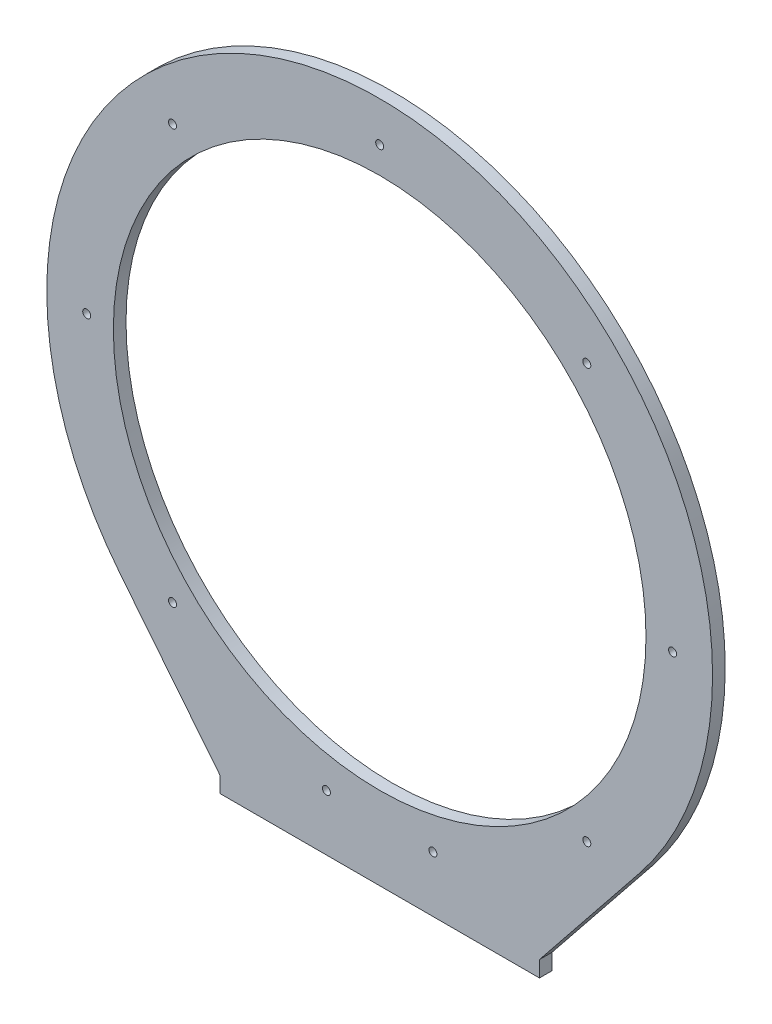
ISO-10303-21;
HEADER;
FILE_DESCRIPTION(('STEP AP214'),'2;1');
FILE_NAME('part.step','',(''),(''),'','','');
FILE_SCHEMA(('AUTOMOTIVE_DESIGN { 1 0 10303 214 1 1 1 1 }'));
ENDSEC;
DATA;
#1=APPLICATION_CONTEXT('core data for automotive mechanical design processes');
#2=APPLICATION_PROTOCOL_DEFINITION('international standard','automotive_design',2000,#1);
#3=PRODUCT_CONTEXT('',#1,'mechanical');
#4=PRODUCT('Part','Part','',(#3));
#5=PRODUCT_RELATED_PRODUCT_CATEGORY('part','',(#4));
#6=PRODUCT_DEFINITION_FORMATION('','',#4);
#7=PRODUCT_DEFINITION_CONTEXT('part definition',#1,'design');
#8=PRODUCT_DEFINITION('design','',#6,#7);
#9=PRODUCT_DEFINITION_SHAPE('','',#8);
#10=(LENGTH_UNIT() NAMED_UNIT(*) SI_UNIT(.MILLI.,.METRE.));
#11=(NAMED_UNIT(*) PLANE_ANGLE_UNIT() SI_UNIT($,.RADIAN.));
#12=(NAMED_UNIT(*) SI_UNIT($,.STERADIAN.) SOLID_ANGLE_UNIT());
#13=UNCERTAINTY_MEASURE_WITH_UNIT(LENGTH_MEASURE(1.E-05),#10,'distance_accuracy_value','');
#14=(GEOMETRIC_REPRESENTATION_CONTEXT(3) GLOBAL_UNCERTAINTY_ASSIGNED_CONTEXT((#13)) GLOBAL_UNIT_ASSIGNED_CONTEXT((#10,
#11,#12)) REPRESENTATION_CONTEXT('',''));
#15=CARTESIAN_POINT('',(0.,0.,0.));
#16=DIRECTION('',(0.,0.,1.));
#17=DIRECTION('',(1.,0.,0.));
#18=AXIS2_PLACEMENT_3D('',#15,#16,#17);
#19=CARTESIAN_POINT('',(97.529258779494,-78.1859557844149,4.75));
#20=DIRECTION('',(-0.780234070235952,0.625487646275319,0.));
#21=DIRECTION('',(-0.625487646275319,-0.780234070235952,0.));
#22=AXIS2_PLACEMENT_3D('',#19,#20,#21);
#23=PLANE('',#22);
#24=DIRECTION('',(0.625487646275319,0.780234070235952,0.));
#25=VECTOR('',#24,1.);
#26=CARTESIAN_POINT('',(97.529258779494,-78.1859557844149,0.));
#27=LINE('',#26,#25);
#28=CARTESIAN_POINT('',(60.0000000000001,-125.000000002283,0.));
#29=VERTEX_POINT('',#28);
#30=CARTESIAN_POINT('',(97.5292587765192,-78.1859557881257,0.));
#31=VERTEX_POINT('',#30);
#32=EDGE_CURVE('E162',#29,#31,#27,.T.);
#33=ORIENTED_EDGE('',*,*,#32,.T.);
#34=DIRECTION('',(0.,0.,-1.));
#35=VECTOR('',#34,1.);
#36=CARTESIAN_POINT('',(97.5292587765192,-78.1859557881257,4.75));
#37=LINE('',#36,#35);
#38=CARTESIAN_POINT('',(97.5292587765192,-78.1859557881257,4.75));
#39=VERTEX_POINT('',#38);
#40=EDGE_CURVE('E11',#39,#31,#37,.T.);
#41=ORIENTED_EDGE('',*,*,#40,.F.);
#42=DIRECTION('',(0.625487646275319,0.780234070235952,0.));
#43=VECTOR('',#42,1.);
#44=CARTESIAN_POINT('',(97.529258779494,-78.1859557844149,4.75));
#45=LINE('',#44,#43);
#46=CARTESIAN_POINT('',(60.0000000000001,-125.000000002283,4.75));
#47=VERTEX_POINT('',#46);
#48=EDGE_CURVE('E206',#47,#39,#45,.T.);
#49=ORIENTED_EDGE('',*,*,#48,.F.);
#50=DIRECTION('',(0.,0.,-1.));
#51=VECTOR('',#50,1.);
#52=CARTESIAN_POINT('',(60.0000000000001,-125.000000002283,4.75));
#53=LINE('',#52,#51);
#54=EDGE_CURVE('E63',#47,#29,#53,.T.);
#55=ORIENTED_EDGE('',*,*,#54,.T.);
#56=EDGE_LOOP('',(#33,#41,#49,#55));
#57=FACE_BOUND('',#56,.T.);
#58=ADVANCED_FACE('F47',(#57),#23,.F.);
#59=CARTESIAN_POINT('',(0.,0.,4.75));
#60=DIRECTION('',(0.,0.,-1.));
#61=DIRECTION('',(-1.,0.,0.));
#62=AXIS2_PLACEMENT_3D('',#59,#60,#61);
#63=CYLINDRICAL_SURFACE('',#62,125.);
#64=CARTESIAN_POINT('',(0.,0.,0.));
#65=DIRECTION('',(0.,0.,1.));
#66=DIRECTION('',(1.,0.,0.));
#67=AXIS2_PLACEMENT_3D('',#64,#65,#66);
#68=CIRCLE('',#67,125.);
#69=CARTESIAN_POINT('',(-97.5292587765195,-78.1859557881253,0.));
#70=VERTEX_POINT('',#69);
#71=EDGE_CURVE('E164',#31,#70,#68,.T.);
#72=ORIENTED_EDGE('',*,*,#71,.T.);
#73=DIRECTION('',(0.,0.,-1.));
#74=VECTOR('',#73,1.);
#75=CARTESIAN_POINT('',(-97.5292587765195,-78.1859557881253,4.75));
#76=LINE('',#75,#74);
#77=CARTESIAN_POINT('',(-97.5292587765195,-78.1859557881253,4.75));
#78=VERTEX_POINT('',#77);
#79=EDGE_CURVE('E55',#78,#70,#76,.T.);
#80=ORIENTED_EDGE('',*,*,#79,.F.);
#81=CARTESIAN_POINT('',(0.,0.,4.75));
#82=DIRECTION('',(0.,0.,1.));
#83=DIRECTION('',(1.,0.,0.));
#84=AXIS2_PLACEMENT_3D('',#81,#82,#83);
#85=CIRCLE('',#84,125.);
#86=EDGE_CURVE('E96',#39,#78,#85,.T.);
#87=ORIENTED_EDGE('',*,*,#86,.F.);
#88=ORIENTED_EDGE('',*,*,#40,.T.);
#89=EDGE_LOOP('',(#72,#80,#87,#88));
#90=FACE_BOUND('',#89,.T.);
#91=ADVANCED_FACE('F212',(#90),#63,.T.);
#92=CARTESIAN_POINT('',(-97.529258779494,-78.1859557844149,4.75));
#93=DIRECTION('',(-0.780234070235952,-0.625487646275319,0.));
#94=DIRECTION('',(0.625487646275319,-0.780234070235952,0.));
#95=AXIS2_PLACEMENT_3D('',#92,#93,#94);
#96=PLANE('',#95);
#97=DIRECTION('',(-0.62548764627532,0.780234070235952,0.));
#98=VECTOR('',#97,1.);
#99=CARTESIAN_POINT('',(-97.529258779494,-78.1859557844149,0.));
#100=LINE('',#99,#98);
#101=CARTESIAN_POINT('',(-60.,-125.000000002283,0.));
#102=VERTEX_POINT('',#101);
#103=EDGE_CURVE('E167',#102,#70,#100,.T.);
#104=ORIENTED_EDGE('',*,*,#103,.F.);
#105=DIRECTION('',(0.,0.,-1.));
#106=VECTOR('',#105,1.);
#107=CARTESIAN_POINT('',(-60.,-125.000000002283,4.75));
#108=LINE('',#107,#106);
#109=CARTESIAN_POINT('',(-60.,-125.000000002283,4.75));
#110=VERTEX_POINT('',#109);
#111=EDGE_CURVE('E124',#110,#102,#108,.T.);
#112=ORIENTED_EDGE('',*,*,#111,.F.);
#113=DIRECTION('',(-0.62548764627532,0.780234070235952,0.));
#114=VECTOR('',#113,1.);
#115=CARTESIAN_POINT('',(-97.529258779494,-78.1859557844149,4.75));
#116=LINE('',#115,#114);
#117=EDGE_CURVE('E114',#110,#78,#116,.T.);
#118=ORIENTED_EDGE('',*,*,#117,.T.);
#119=ORIENTED_EDGE('',*,*,#79,.T.);
#120=EDGE_LOOP('',(#104,#112,#118,#119));
#121=FACE_BOUND('',#120,.T.);
#122=ADVANCED_FACE('F211',(#121),#96,.T.);
#123=CARTESIAN_POINT('',(-60.,0.,4.75));
#124=DIRECTION('',(1.,0.,0.));
#125=DIRECTION('',(0.,0.,-1.));
#126=AXIS2_PLACEMENT_3D('',#123,#124,#125);
#127=PLANE('',#126);
#128=DIRECTION('',(0.,-1.,0.));
#129=VECTOR('',#128,1.);
#130=CARTESIAN_POINT('',(-60.,0.,0.));
#131=LINE('',#130,#129);
#132=CARTESIAN_POINT('',(-60.,-131.000000002283,0.));
#133=VERTEX_POINT('',#132);
#134=EDGE_CURVE('E121',#102,#133,#131,.T.);
#135=ORIENTED_EDGE('',*,*,#134,.T.);
#136=DIRECTION('',(0.,0.,-1.));
#137=VECTOR('',#136,1.);
#138=CARTESIAN_POINT('',(-60.,-131.000000002283,4.75));
#139=LINE('',#138,#137);
#140=CARTESIAN_POINT('',(-60.,-131.000000002283,4.75));
#141=VERTEX_POINT('',#140);
#142=EDGE_CURVE('E118',#141,#133,#139,.T.);
#143=ORIENTED_EDGE('',*,*,#142,.F.);
#144=DIRECTION('',(0.,-1.,0.));
#145=VECTOR('',#144,1.);
#146=CARTESIAN_POINT('',(-60.,0.,4.75));
#147=LINE('',#146,#145);
#148=EDGE_CURVE('E106',#110,#141,#147,.T.);
#149=ORIENTED_EDGE('',*,*,#148,.F.);
#150=ORIENTED_EDGE('',*,*,#111,.T.);
#151=EDGE_LOOP('',(#135,#143,#149,#150));
#152=FACE_BOUND('',#151,.T.);
#153=ADVANCED_FACE('F119',(#152),#127,.F.);
#154=CARTESIAN_POINT('',(0.,-131.000000002283,4.75));
#155=DIRECTION('',(0.,1.,0.));
#156=DIRECTION('',(-1.,0.,0.));
#157=AXIS2_PLACEMENT_3D('',#154,#155,#156);
#158=PLANE('',#157);
#159=DIRECTION('',(1.,0.,0.));
#160=VECTOR('',#159,1.);
#161=CARTESIAN_POINT('',(0.,-131.000000002283,0.));
#162=LINE('',#161,#160);
#163=CARTESIAN_POINT('',(60.0000000000001,-131.000000002283,0.));
#164=VERTEX_POINT('',#163);
#165=EDGE_CURVE('E171',#133,#164,#162,.T.);
#166=ORIENTED_EDGE('',*,*,#165,.T.);
#167=DIRECTION('',(0.,0.,-1.));
#168=VECTOR('',#167,1.);
#169=CARTESIAN_POINT('',(60.0000000000001,-131.000000002283,4.75));
#170=LINE('',#169,#168);
#171=CARTESIAN_POINT('',(60.0000000000001,-131.000000002283,4.75));
#172=VERTEX_POINT('',#171);
#173=EDGE_CURVE('E84',#172,#164,#170,.T.);
#174=ORIENTED_EDGE('',*,*,#173,.F.);
#175=DIRECTION('',(1.,0.,0.));
#176=VECTOR('',#175,1.);
#177=CARTESIAN_POINT('',(0.,-131.000000002283,4.75));
#178=LINE('',#177,#176);
#179=EDGE_CURVE('E112',#141,#172,#178,.T.);
#180=ORIENTED_EDGE('',*,*,#179,.F.);
#181=ORIENTED_EDGE('',*,*,#142,.T.);
#182=EDGE_LOOP('',(#166,#174,#180,#181));
#183=FACE_BOUND('',#182,.T.);
#184=ADVANCED_FACE('F126',(#183),#158,.F.);
#185=CARTESIAN_POINT('',(-20.0000000000001,-110.,4.75));
#186=DIRECTION('',(0.,0.,-1.));
#187=DIRECTION('',(-1.,0.,0.));
#188=AXIS2_PLACEMENT_3D('',#185,#186,#187);
#189=CYLINDRICAL_SURFACE('',#188,1.5);
#190=CARTESIAN_POINT('',(-20.0000000000001,-110.,4.75));
#191=DIRECTION('',(0.,0.,1.));
#192=DIRECTION('',(1.,0.,0.));
#193=AXIS2_PLACEMENT_3D('',#190,#191,#192);
#194=CIRCLE('',#193,1.5);
#195=CARTESIAN_POINT('',(-18.5000000000001,-110.,4.75));
#196=VERTEX_POINT('',#195);
#197=EDGE_CURVE('E156',#196,#196,#194,.T.);
#198=ORIENTED_EDGE('',*,*,#197,.T.);
#199=EDGE_LOOP('',(#198));
#200=FACE_BOUND('',#199,.T.);
#201=CARTESIAN_POINT('',(-20.0000000000001,-110.,0.));
#202=DIRECTION('',(0.,0.,1.));
#203=DIRECTION('',(1.,0.,0.));
#204=AXIS2_PLACEMENT_3D('',#201,#202,#203);
#205=CIRCLE('',#204,1.5);
#206=CARTESIAN_POINT('',(-18.5000000000001,-110.,0.));
#207=VERTEX_POINT('',#206);
#208=EDGE_CURVE('E200',#207,#207,#205,.T.);
#209=ORIENTED_EDGE('',*,*,#208,.F.);
#210=EDGE_LOOP('',(#209));
#211=FACE_BOUND('',#210,.T.);
#212=ADVANCED_FACE('F245',(#200,#211),#189,.F.);
#213=CARTESIAN_POINT('',(-110.,0.,4.75));
#214=DIRECTION('',(0.,0.,-1.));
#215=DIRECTION('',(-1.,0.,0.));
#216=AXIS2_PLACEMENT_3D('',#213,#214,#215);
#217=CYLINDRICAL_SURFACE('',#216,1.5);
#218=CARTESIAN_POINT('',(-110.,0.,4.75));
#219=DIRECTION('',(0.,0.,1.));
#220=DIRECTION('',(1.,0.,0.));
#221=AXIS2_PLACEMENT_3D('',#218,#219,#220);
#222=CIRCLE('',#221,1.5);
#223=CARTESIAN_POINT('',(-108.5,0.,4.75));
#224=VERTEX_POINT('',#223);
#225=EDGE_CURVE('E153',#224,#224,#222,.F.);
#226=ORIENTED_EDGE('',*,*,#225,.F.);
#227=EDGE_LOOP('',(#226));
#228=FACE_BOUND('',#227,.T.);
#229=CARTESIAN_POINT('',(-110.,0.,0.));
#230=DIRECTION('',(0.,0.,1.));
#231=DIRECTION('',(1.,0.,0.));
#232=AXIS2_PLACEMENT_3D('',#229,#230,#231);
#233=CIRCLE('',#232,1.5);
#234=CARTESIAN_POINT('',(-108.5,0.,0.));
#235=VERTEX_POINT('',#234);
#236=EDGE_CURVE('E197',#235,#235,#233,.F.);
#237=ORIENTED_EDGE('',*,*,#236,.T.);
#238=EDGE_LOOP('',(#237));
#239=FACE_BOUND('',#238,.T.);
#240=ADVANCED_FACE('F249',(#228,#239),#217,.F.);
#241=CARTESIAN_POINT('',(110.,0.,4.75));
#242=DIRECTION('',(0.,0.,-1.));
#243=DIRECTION('',(-1.,0.,0.));
#244=AXIS2_PLACEMENT_3D('',#241,#242,#243);
#245=CYLINDRICAL_SURFACE('',#244,1.5);
#246=CARTESIAN_POINT('',(110.,0.,4.75));
#247=DIRECTION('',(0.,0.,1.));
#248=DIRECTION('',(1.,0.,0.));
#249=AXIS2_PLACEMENT_3D('',#246,#247,#248);
#250=CIRCLE('',#249,1.5);
#251=CARTESIAN_POINT('',(111.5,0.,4.75));
#252=VERTEX_POINT('',#251);
#253=EDGE_CURVE('E150',#252,#252,#250,.T.);
#254=ORIENTED_EDGE('',*,*,#253,.T.);
#255=EDGE_LOOP('',(#254));
#256=FACE_BOUND('',#255,.T.);
#257=CARTESIAN_POINT('',(110.,0.,0.));
#258=DIRECTION('',(0.,0.,1.));
#259=DIRECTION('',(1.,0.,0.));
#260=AXIS2_PLACEMENT_3D('',#257,#258,#259);
#261=CIRCLE('',#260,1.5);
#262=CARTESIAN_POINT('',(111.5,0.,0.));
#263=VERTEX_POINT('',#262);
#264=EDGE_CURVE('E194',#263,#263,#261,.T.);
#265=ORIENTED_EDGE('',*,*,#264,.F.);
#266=EDGE_LOOP('',(#265));
#267=FACE_BOUND('',#266,.T.);
#268=ADVANCED_FACE('F255',(#256,#267),#245,.F.);
#269=CARTESIAN_POINT('',(-77.7817459305205,-77.78174593052,4.75));
#270=DIRECTION('',(0.,0.,-1.));
#271=DIRECTION('',(-1.,0.,0.));
#272=AXIS2_PLACEMENT_3D('',#269,#270,#271);
#273=CYLINDRICAL_SURFACE('',#272,1.5);
#274=CARTESIAN_POINT('',(-77.7817459305205,-77.78174593052,4.75));
#275=DIRECTION('',(0.,0.,1.));
#276=DIRECTION('',(1.,0.,0.));
#277=AXIS2_PLACEMENT_3D('',#274,#275,#276);
#278=CIRCLE('',#277,1.5);
#279=CARTESIAN_POINT('',(-76.2817459305205,-77.78174593052,4.75));
#280=VERTEX_POINT('',#279);
#281=EDGE_CURVE('E147',#280,#280,#278,.F.);
#282=ORIENTED_EDGE('',*,*,#281,.F.);
#283=EDGE_LOOP('',(#282));
#284=FACE_BOUND('',#283,.T.);
#285=CARTESIAN_POINT('',(-77.7817459305205,-77.78174593052,0.));
#286=DIRECTION('',(0.,0.,1.));
#287=DIRECTION('',(1.,0.,0.));
#288=AXIS2_PLACEMENT_3D('',#285,#286,#287);
#289=CIRCLE('',#288,1.5);
#290=CARTESIAN_POINT('',(-76.2817459305205,-77.78174593052,0.));
#291=VERTEX_POINT('',#290);
#292=EDGE_CURVE('E191',#291,#291,#289,.F.);
#293=ORIENTED_EDGE('',*,*,#292,.T.);
#294=EDGE_LOOP('',(#293));
#295=FACE_BOUND('',#294,.T.);
#296=ADVANCED_FACE('F263',(#284,#295),#273,.F.);
#297=CARTESIAN_POINT('',(0.,0.,4.75));
#298=DIRECTION('',(0.,0.,-1.));
#299=DIRECTION('',(-1.,0.,0.));
#300=AXIS2_PLACEMENT_3D('',#297,#298,#299);
#301=CYLINDRICAL_SURFACE('',#300,100.);
#302=CARTESIAN_POINT('',(0.,0.,4.75));
#303=DIRECTION('',(0.,0.,1.));
#304=DIRECTION('',(1.,0.,0.));
#305=AXIS2_PLACEMENT_3D('',#302,#303,#304);
#306=CIRCLE('',#305,100.);
#307=CARTESIAN_POINT('',(100.,0.,4.75));
#308=VERTEX_POINT('',#307);
#309=EDGE_CURVE('E144',#308,#308,#306,.T.);
#310=ORIENTED_EDGE('',*,*,#309,.T.);
#311=EDGE_LOOP('',(#310));
#312=FACE_BOUND('',#311,.T.);
#313=CARTESIAN_POINT('',(0.,0.,0.));
#314=DIRECTION('',(0.,0.,1.));
#315=DIRECTION('',(1.,0.,0.));
#316=AXIS2_PLACEMENT_3D('',#313,#314,#315);
#317=CIRCLE('',#316,100.);
#318=CARTESIAN_POINT('',(100.,0.,0.));
#319=VERTEX_POINT('',#318);
#320=EDGE_CURVE('E188',#319,#319,#317,.T.);
#321=ORIENTED_EDGE('',*,*,#320,.F.);
#322=EDGE_LOOP('',(#321));
#323=FACE_BOUND('',#322,.T.);
#324=ADVANCED_FACE('F267',(#312,#323),#301,.F.);
#325=CARTESIAN_POINT('',(77.7817459305201,-77.7817459305204,4.75));
#326=DIRECTION('',(0.,0.,-1.));
#327=DIRECTION('',(-1.,0.,0.));
#328=AXIS2_PLACEMENT_3D('',#325,#326,#327);
#329=CYLINDRICAL_SURFACE('',#328,1.5);
#330=CARTESIAN_POINT('',(77.7817459305201,-77.7817459305204,4.75));
#331=DIRECTION('',(0.,0.,1.));
#332=DIRECTION('',(1.,0.,0.));
#333=AXIS2_PLACEMENT_3D('',#330,#331,#332);
#334=CIRCLE('',#333,1.5);
#335=CARTESIAN_POINT('',(79.2817459305201,-77.7817459305204,4.75));
#336=VERTEX_POINT('',#335);
#337=EDGE_CURVE('E141',#336,#336,#334,.T.);
#338=ORIENTED_EDGE('',*,*,#337,.T.);
#339=EDGE_LOOP('',(#338));
#340=FACE_BOUND('',#339,.T.);
#341=CARTESIAN_POINT('',(77.7817459305201,-77.7817459305204,0.));
#342=DIRECTION('',(0.,0.,1.));
#343=DIRECTION('',(1.,0.,0.));
#344=AXIS2_PLACEMENT_3D('',#341,#342,#343);
#345=CIRCLE('',#344,1.5);
#346=CARTESIAN_POINT('',(79.2817459305201,-77.7817459305204,0.));
#347=VERTEX_POINT('',#346);
#348=EDGE_CURVE('E185',#347,#347,#345,.T.);
#349=ORIENTED_EDGE('',*,*,#348,.F.);
#350=EDGE_LOOP('',(#349));
#351=FACE_BOUND('',#350,.T.);
#352=ADVANCED_FACE('F271',(#340,#351),#329,.F.);
#353=CARTESIAN_POINT('',(77.7817459305202,77.7817459305202,4.75));
#354=DIRECTION('',(0.,0.,-1.));
#355=DIRECTION('',(-1.,0.,0.));
#356=AXIS2_PLACEMENT_3D('',#353,#354,#355);
#357=CYLINDRICAL_SURFACE('',#356,1.5);
#358=CARTESIAN_POINT('',(77.7817459305202,77.7817459305202,4.75));
#359=DIRECTION('',(0.,0.,1.));
#360=DIRECTION('',(1.,0.,0.));
#361=AXIS2_PLACEMENT_3D('',#358,#359,#360);
#362=CIRCLE('',#361,1.5);
#363=CARTESIAN_POINT('',(79.2817459305202,77.7817459305202,4.75));
#364=VERTEX_POINT('',#363);
#365=EDGE_CURVE('E138',#364,#364,#362,.T.);
#366=ORIENTED_EDGE('',*,*,#365,.T.);
#367=EDGE_LOOP('',(#366));
#368=FACE_BOUND('',#367,.T.);
#369=CARTESIAN_POINT('',(77.7817459305202,77.7817459305202,0.));
#370=DIRECTION('',(0.,0.,1.));
#371=DIRECTION('',(1.,0.,0.));
#372=AXIS2_PLACEMENT_3D('',#369,#370,#371);
#373=CIRCLE('',#372,1.5);
#374=CARTESIAN_POINT('',(79.2817459305202,77.7817459305202,0.));
#375=VERTEX_POINT('',#374);
#376=EDGE_CURVE('E182',#375,#375,#373,.T.);
#377=ORIENTED_EDGE('',*,*,#376,.F.);
#378=EDGE_LOOP('',(#377));
#379=FACE_BOUND('',#378,.T.);
#380=ADVANCED_FACE('F275',(#368,#379),#357,.F.);
#381=CARTESIAN_POINT('',(0.,110.,4.75));
#382=DIRECTION('',(0.,0.,-1.));
#383=DIRECTION('',(-1.,0.,0.));
#384=AXIS2_PLACEMENT_3D('',#381,#382,#383);
#385=CYLINDRICAL_SURFACE('',#384,1.5);
#386=CARTESIAN_POINT('',(0.,110.,4.75));
#387=DIRECTION('',(0.,0.,1.));
#388=DIRECTION('',(1.,0.,0.));
#389=AXIS2_PLACEMENT_3D('',#386,#387,#388);
#390=CIRCLE('',#389,1.5);
#391=CARTESIAN_POINT('',(1.50000000000002,110.,4.75));
#392=VERTEX_POINT('',#391);
#393=EDGE_CURVE('E135',#392,#392,#390,.F.);
#394=ORIENTED_EDGE('',*,*,#393,.F.);
#395=EDGE_LOOP('',(#394));
#396=FACE_BOUND('',#395,.T.);
#397=CARTESIAN_POINT('',(0.,110.,0.));
#398=DIRECTION('',(0.,0.,1.));
#399=DIRECTION('',(1.,0.,0.));
#400=AXIS2_PLACEMENT_3D('',#397,#398,#399);
#401=CIRCLE('',#400,1.5);
#402=CARTESIAN_POINT('',(1.50000000000002,110.,0.));
#403=VERTEX_POINT('',#402);
#404=EDGE_CURVE('E179',#403,#403,#401,.F.);
#405=ORIENTED_EDGE('',*,*,#404,.T.);
#406=EDGE_LOOP('',(#405));
#407=FACE_BOUND('',#406,.T.);
#408=ADVANCED_FACE('F228',(#396,#407),#385,.F.);
#409=CARTESIAN_POINT('',(-77.7817459305203,77.7817459305201,4.75));
#410=DIRECTION('',(0.,0.,-1.));
#411=DIRECTION('',(-1.,0.,0.));
#412=AXIS2_PLACEMENT_3D('',#409,#410,#411);
#413=CYLINDRICAL_SURFACE('',#412,1.5);
#414=CARTESIAN_POINT('',(-77.7817459305203,77.7817459305201,4.75));
#415=DIRECTION('',(0.,0.,1.));
#416=DIRECTION('',(1.,0.,0.));
#417=AXIS2_PLACEMENT_3D('',#414,#415,#416);
#418=CIRCLE('',#417,1.5);
#419=CARTESIAN_POINT('',(-76.2817459305203,77.7817459305201,4.75));
#420=VERTEX_POINT('',#419);
#421=EDGE_CURVE('E129',#420,#420,#418,.F.);
#422=ORIENTED_EDGE('',*,*,#421,.F.);
#423=EDGE_LOOP('',(#422));
#424=FACE_BOUND('',#423,.T.);
#425=CARTESIAN_POINT('',(-77.7817459305203,77.7817459305201,0.));
#426=DIRECTION('',(0.,0.,1.));
#427=DIRECTION('',(1.,0.,0.));
#428=AXIS2_PLACEMENT_3D('',#425,#426,#427);
#429=CIRCLE('',#428,1.5);
#430=CARTESIAN_POINT('',(-76.2817459305203,77.7817459305201,0.));
#431=VERTEX_POINT('',#430);
#432=EDGE_CURVE('E176',#431,#431,#429,.F.);
#433=ORIENTED_EDGE('',*,*,#432,.T.);
#434=EDGE_LOOP('',(#433));
#435=FACE_BOUND('',#434,.T.);
#436=ADVANCED_FACE('F220',(#424,#435),#413,.F.);
#437=CARTESIAN_POINT('',(60.0000000000001,0.,4.75));
#438=DIRECTION('',(1.,0.,0.));
#439=DIRECTION('',(0.,0.,-1.));
#440=AXIS2_PLACEMENT_3D('',#437,#438,#439);
#441=PLANE('',#440);
#442=DIRECTION('',(0.,-1.,0.));
#443=VECTOR('',#442,1.);
#444=CARTESIAN_POINT('',(60.0000000000001,0.,0.));
#445=LINE('',#444,#443);
#446=EDGE_CURVE('E173',#29,#164,#445,.T.);
#447=ORIENTED_EDGE('',*,*,#446,.F.);
#448=ORIENTED_EDGE('',*,*,#54,.F.);
#449=DIRECTION('',(0.,-1.,0.));
#450=VECTOR('',#449,1.);
#451=CARTESIAN_POINT('',(60.0000000000001,0.,4.75));
#452=LINE('',#451,#450);
#453=EDGE_CURVE('E127',#47,#172,#452,.T.);
#454=ORIENTED_EDGE('',*,*,#453,.T.);
#455=ORIENTED_EDGE('',*,*,#173,.T.);
#456=EDGE_LOOP('',(#447,#448,#454,#455));
#457=FACE_BOUND('',#456,.T.);
#458=ADVANCED_FACE('F217',(#457),#441,.T.);
#459=CARTESIAN_POINT('',(20.0000000000002,-110.,4.75));
#460=DIRECTION('',(0.,0.,-1.));
#461=DIRECTION('',(-1.,0.,0.));
#462=AXIS2_PLACEMENT_3D('',#459,#460,#461);
#463=CYLINDRICAL_SURFACE('',#462,1.5);
#464=CARTESIAN_POINT('',(20.0000000000002,-110.,4.75));
#465=DIRECTION('',(0.,0.,1.));
#466=DIRECTION('',(1.,0.,0.));
#467=AXIS2_PLACEMENT_3D('',#464,#465,#466);
#468=CIRCLE('',#467,1.5);
#469=CARTESIAN_POINT('',(21.5000000000002,-110.,4.75));
#470=VERTEX_POINT('',#469);
#471=EDGE_CURVE('E159',#470,#470,#468,.F.);
#472=ORIENTED_EDGE('',*,*,#471,.F.);
#473=EDGE_LOOP('',(#472));
#474=FACE_BOUND('',#473,.T.);
#475=CARTESIAN_POINT('',(20.0000000000002,-110.,0.));
#476=DIRECTION('',(0.,0.,1.));
#477=DIRECTION('',(1.,0.,0.));
#478=AXIS2_PLACEMENT_3D('',#475,#476,#477);
#479=CIRCLE('',#478,1.5);
#480=CARTESIAN_POINT('',(21.5000000000002,-110.,0.));
#481=VERTEX_POINT('',#480);
#482=EDGE_CURVE('E203',#481,#481,#479,.F.);
#483=ORIENTED_EDGE('',*,*,#482,.T.);
#484=EDGE_LOOP('',(#483));
#485=FACE_BOUND('',#484,.T.);
#486=ADVANCED_FACE('F219',(#474,#485),#463,.F.);
#487=CARTESIAN_POINT('',(0.,0.,4.75));
#488=DIRECTION('',(0.,0.,1.));
#489=DIRECTION('',(1.,0.,0.));
#490=AXIS2_PLACEMENT_3D('',#487,#488,#489);
#491=PLANE('',#490);
#492=ORIENTED_EDGE('',*,*,#48,.T.);
#493=ORIENTED_EDGE('',*,*,#86,.T.);
#494=ORIENTED_EDGE('',*,*,#117,.F.);
#495=ORIENTED_EDGE('',*,*,#148,.T.);
#496=ORIENTED_EDGE('',*,*,#179,.T.);
#497=ORIENTED_EDGE('',*,*,#453,.F.);
#498=EDGE_LOOP('',(#492,#493,#494,#495,#496,#497));
#499=FACE_BOUND('',#498,.T.);
#500=ORIENTED_EDGE('',*,*,#421,.T.);
#501=EDGE_LOOP('',(#500));
#502=FACE_BOUND('',#501,.T.);
#503=ORIENTED_EDGE('',*,*,#393,.T.);
#504=EDGE_LOOP('',(#503));
#505=FACE_BOUND('',#504,.T.);
#506=ORIENTED_EDGE('',*,*,#365,.F.);
#507=EDGE_LOOP('',(#506));
#508=FACE_BOUND('',#507,.T.);
#509=ORIENTED_EDGE('',*,*,#337,.F.);
#510=EDGE_LOOP('',(#509));
#511=FACE_BOUND('',#510,.T.);
#512=ORIENTED_EDGE('',*,*,#309,.F.);
#513=EDGE_LOOP('',(#512));
#514=FACE_BOUND('',#513,.T.);
#515=ORIENTED_EDGE('',*,*,#281,.T.);
#516=EDGE_LOOP('',(#515));
#517=FACE_BOUND('',#516,.T.);
#518=ORIENTED_EDGE('',*,*,#253,.F.);
#519=EDGE_LOOP('',(#518));
#520=FACE_BOUND('',#519,.T.);
#521=ORIENTED_EDGE('',*,*,#225,.T.);
#522=EDGE_LOOP('',(#521));
#523=FACE_BOUND('',#522,.T.);
#524=ORIENTED_EDGE('',*,*,#197,.F.);
#525=EDGE_LOOP('',(#524));
#526=FACE_BOUND('',#525,.T.);
#527=ORIENTED_EDGE('',*,*,#471,.T.);
#528=EDGE_LOOP('',(#527));
#529=FACE_BOUND('',#528,.T.);
#530=ADVANCED_FACE('F108',(#499,#502,#505,#508,#511,#514,#517,#520,#523,#526,#529),#491,.T.);
#531=CARTESIAN_POINT('',(0.,0.,0.));
#532=DIRECTION('',(0.,0.,1.));
#533=DIRECTION('',(1.,0.,0.));
#534=AXIS2_PLACEMENT_3D('',#531,#532,#533);
#535=PLANE('',#534);
#536=ORIENTED_EDGE('',*,*,#32,.F.);
#537=ORIENTED_EDGE('',*,*,#446,.T.);
#538=ORIENTED_EDGE('',*,*,#165,.F.);
#539=ORIENTED_EDGE('',*,*,#134,.F.);
#540=ORIENTED_EDGE('',*,*,#103,.T.);
#541=ORIENTED_EDGE('',*,*,#71,.F.);
#542=EDGE_LOOP('',(#536,#537,#538,#539,#540,#541));
#543=FACE_BOUND('',#542,.T.);
#544=ORIENTED_EDGE('',*,*,#432,.F.);
#545=EDGE_LOOP('',(#544));
#546=FACE_BOUND('',#545,.T.);
#547=ORIENTED_EDGE('',*,*,#404,.F.);
#548=EDGE_LOOP('',(#547));
#549=FACE_BOUND('',#548,.T.);
#550=ORIENTED_EDGE('',*,*,#376,.T.);
#551=EDGE_LOOP('',(#550));
#552=FACE_BOUND('',#551,.T.);
#553=ORIENTED_EDGE('',*,*,#348,.T.);
#554=EDGE_LOOP('',(#553));
#555=FACE_BOUND('',#554,.T.);
#556=ORIENTED_EDGE('',*,*,#320,.T.);
#557=EDGE_LOOP('',(#556));
#558=FACE_BOUND('',#557,.T.);
#559=ORIENTED_EDGE('',*,*,#292,.F.);
#560=EDGE_LOOP('',(#559));
#561=FACE_BOUND('',#560,.T.);
#562=ORIENTED_EDGE('',*,*,#264,.T.);
#563=EDGE_LOOP('',(#562));
#564=FACE_BOUND('',#563,.T.);
#565=ORIENTED_EDGE('',*,*,#236,.F.);
#566=EDGE_LOOP('',(#565));
#567=FACE_BOUND('',#566,.T.);
#568=ORIENTED_EDGE('',*,*,#208,.T.);
#569=EDGE_LOOP('',(#568));
#570=FACE_BOUND('',#569,.T.);
#571=ORIENTED_EDGE('',*,*,#482,.F.);
#572=EDGE_LOOP('',(#571));
#573=FACE_BOUND('',#572,.T.);
#574=ADVANCED_FACE('F215',(#543,#546,#549,#552,#555,#558,#561,#564,#567,#570,#573),#535,.F.);
#575=CLOSED_SHELL('',(#58,#91,#122,#153,#184,#212,#240,#268,#296,#324,#352,#380,#408,#436,#458,
#486,#530,#574));
#576=MANIFOLD_SOLID_BREP('B2',#575);
#577=ADVANCED_BREP_SHAPE_REPRESENTATION('',(#18,#576),#14);
#578=SHAPE_DEFINITION_REPRESENTATION(#9,#577);
ENDSEC;
END-ISO-10303-21;
